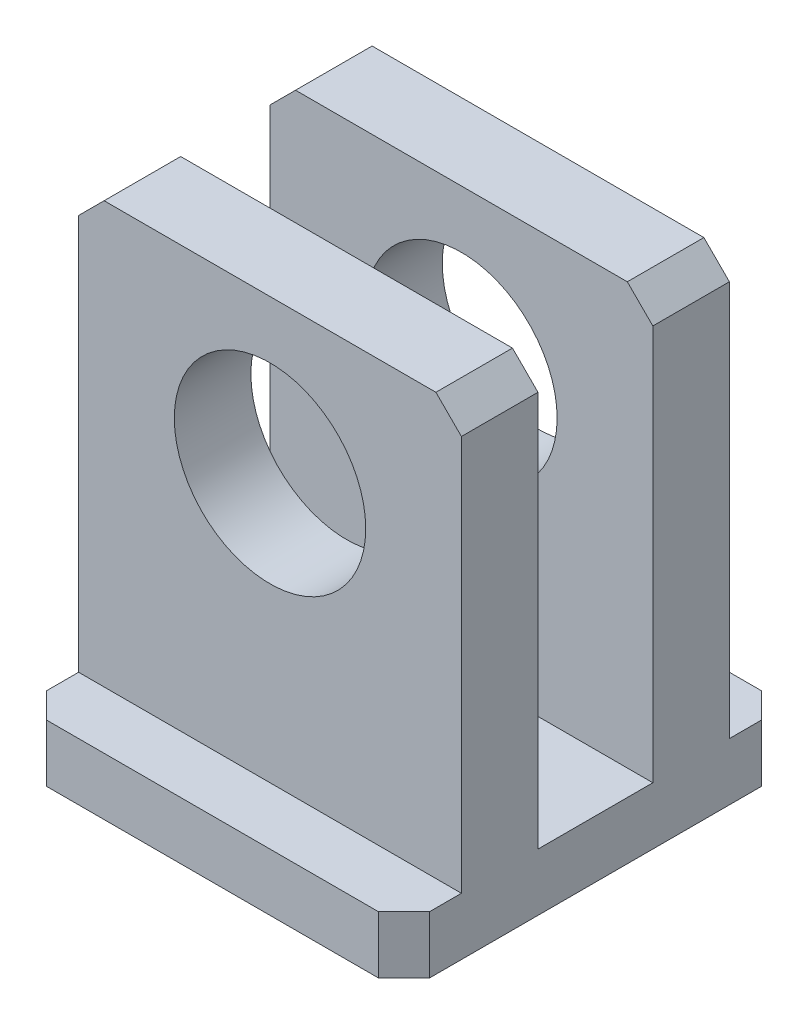
ISO-10303-21;
HEADER;
FILE_DESCRIPTION(('STEP AP214'),'2;1');
FILE_NAME('part.step','',(''),(''),'','','');
FILE_SCHEMA(('AUTOMOTIVE_DESIGN { 1 0 10303 214 1 1 1 1 }'));
ENDSEC;
DATA;
#1=APPLICATION_CONTEXT('core data for automotive mechanical design processes');
#2=APPLICATION_PROTOCOL_DEFINITION('international standard','automotive_design',2000,#1);
#3=PRODUCT_CONTEXT('',#1,'mechanical');
#4=PRODUCT('Part','Part','',(#3));
#5=PRODUCT_RELATED_PRODUCT_CATEGORY('part','',(#4));
#6=PRODUCT_DEFINITION_FORMATION('','',#4);
#7=PRODUCT_DEFINITION_CONTEXT('part definition',#1,'design');
#8=PRODUCT_DEFINITION('design','',#6,#7);
#9=PRODUCT_DEFINITION_SHAPE('','',#8);
#10=(LENGTH_UNIT() NAMED_UNIT(*) SI_UNIT(.MILLI.,.METRE.));
#11=(NAMED_UNIT(*) PLANE_ANGLE_UNIT() SI_UNIT($,.RADIAN.));
#12=(NAMED_UNIT(*) SI_UNIT($,.STERADIAN.) SOLID_ANGLE_UNIT());
#13=UNCERTAINTY_MEASURE_WITH_UNIT(LENGTH_MEASURE(1.E-05),#10,'distance_accuracy_value','');
#14=(GEOMETRIC_REPRESENTATION_CONTEXT(3) GLOBAL_UNCERTAINTY_ASSIGNED_CONTEXT((#13)) GLOBAL_UNIT_ASSIGNED_CONTEXT((#10,
#11,#12)) REPRESENTATION_CONTEXT('',''));
#15=CARTESIAN_POINT('',(0.,0.,0.));
#16=DIRECTION('',(0.,0.,1.));
#17=DIRECTION('',(1.,0.,0.));
#18=AXIS2_PLACEMENT_3D('',#15,#16,#17);
#19=CARTESIAN_POINT('',(0.,37.5,0.));
#20=DIRECTION('',(0.,1.,0.));
#21=DIRECTION('',(0.,0.,1.));
#22=AXIS2_PLACEMENT_3D('',#19,#20,#21);
#23=PLANE('',#22);
#24=DIRECTION('',(0.,0.,1.));
#25=VECTOR('',#24,1.);
#26=CARTESIAN_POINT('',(-13.,37.5,-15.));
#27=LINE('',#26,#25);
#28=CARTESIAN_POINT('',(-13.,37.5,4.5));
#29=VERTEX_POINT('',#28);
#30=CARTESIAN_POINT('',(-13.,37.5,10.5));
#31=VERTEX_POINT('',#30);
#32=EDGE_CURVE('E64',#29,#31,#27,.T.);
#33=ORIENTED_EDGE('',*,*,#32,.T.);
#34=DIRECTION('',(1.,0.,0.));
#35=VECTOR('',#34,1.);
#36=CARTESIAN_POINT('',(-15.,37.5,10.5));
#37=LINE('',#36,#35);
#38=CARTESIAN_POINT('',(13.,37.5,10.5));
#39=VERTEX_POINT('',#38);
#40=EDGE_CURVE('E195',#31,#39,#37,.T.);
#41=ORIENTED_EDGE('',*,*,#40,.T.);
#42=DIRECTION('',(0.,0.,1.));
#43=VECTOR('',#42,1.);
#44=CARTESIAN_POINT('',(13.,37.5,-15.));
#45=LINE('',#44,#43);
#46=CARTESIAN_POINT('',(13.,37.5,4.5));
#47=VERTEX_POINT('',#46);
#48=EDGE_CURVE('E334',#47,#39,#45,.T.);
#49=ORIENTED_EDGE('',*,*,#48,.F.);
#50=DIRECTION('',(1.,0.,0.));
#51=VECTOR('',#50,1.);
#52=CARTESIAN_POINT('',(-15.,37.5,4.5));
#53=LINE('',#52,#51);
#54=EDGE_CURVE('E293',#29,#47,#53,.T.);
#55=ORIENTED_EDGE('',*,*,#54,.F.);
#56=EDGE_LOOP('',(#33,#41,#49,#55));
#57=FACE_BOUND('',#56,.T.);
#58=ADVANCED_FACE('F41',(#57),#23,.T.);
#59=CARTESIAN_POINT('',(0.,4.5,0.));
#60=DIRECTION('',(0.,-1.,0.));
#61=DIRECTION('',(0.,0.,-1.));
#62=AXIS2_PLACEMENT_3D('',#59,#60,#61);
#63=PLANE('',#62);
#64=DIRECTION('',(1.,0.,0.));
#65=VECTOR('',#64,1.);
#66=CARTESIAN_POINT('',(-15.,4.5,10.5));
#67=LINE('',#66,#65);
#68=CARTESIAN_POINT('',(-15.,4.5,10.5));
#69=VERTEX_POINT('',#68);
#70=CARTESIAN_POINT('',(15.,4.5,10.5));
#71=VERTEX_POINT('',#70);
#72=EDGE_CURVE('E317',#69,#71,#67,.T.);
#73=ORIENTED_EDGE('',*,*,#72,.F.);
#74=DIRECTION('',(0.,0.,1.));
#75=VECTOR('',#74,1.);
#76=CARTESIAN_POINT('',(-15.,4.5,13.));
#77=LINE('',#76,#75);
#78=CARTESIAN_POINT('',(-15.,4.5,13.));
#79=VERTEX_POINT('',#78);
#80=EDGE_CURVE('E200',#69,#79,#77,.T.);
#81=ORIENTED_EDGE('',*,*,#80,.T.);
#82=DIRECTION('',(0.707106781186548,0.,0.707106781186548));
#83=VECTOR('',#82,1.);
#84=CARTESIAN_POINT('',(-15.,4.5,13.));
#85=LINE('',#84,#83);
#86=CARTESIAN_POINT('',(-13.,4.5,15.));
#87=VERTEX_POINT('',#86);
#88=EDGE_CURVE('E214',#79,#87,#85,.T.);
#89=ORIENTED_EDGE('',*,*,#88,.T.);
#90=DIRECTION('',(1.,0.,0.));
#91=VECTOR('',#90,1.);
#92=CARTESIAN_POINT('',(-13.,4.5,15.));
#93=LINE('',#92,#91);
#94=CARTESIAN_POINT('',(13.,4.5,15.));
#95=VERTEX_POINT('',#94);
#96=EDGE_CURVE('E216',#87,#95,#93,.T.);
#97=ORIENTED_EDGE('',*,*,#96,.T.);
#98=DIRECTION('',(0.707106781186548,0.,-0.707106781186548));
#99=VECTOR('',#98,1.);
#100=CARTESIAN_POINT('',(13.,4.5,15.));
#101=LINE('',#100,#99);
#102=CARTESIAN_POINT('',(15.,4.5,13.));
#103=VERTEX_POINT('',#102);
#104=EDGE_CURVE('E218',#95,#103,#101,.T.);
#105=ORIENTED_EDGE('',*,*,#104,.T.);
#106=DIRECTION('',(0.,0.,-1.));
#107=VECTOR('',#106,1.);
#108=CARTESIAN_POINT('',(15.,4.5,13.));
#109=LINE('',#108,#107);
#110=EDGE_CURVE('E221',#103,#71,#109,.T.);
#111=ORIENTED_EDGE('',*,*,#110,.T.);
#112=EDGE_LOOP('',(#73,#81,#89,#97,#105,#111));
#113=FACE_BOUND('',#112,.T.);
#114=ADVANCED_FACE('F322',(#113),#63,.F.);
#115=DIRECTION('',(-1.,0.,0.));
#116=VECTOR('',#115,1.);
#117=CARTESIAN_POINT('',(-15.,4.5,-10.5));
#118=LINE('',#117,#116);
#119=CARTESIAN_POINT('',(15.,4.5,-10.5));
#120=VERTEX_POINT('',#119);
#121=CARTESIAN_POINT('',(-15.,4.5,-10.5));
#122=VERTEX_POINT('',#121);
#123=EDGE_CURVE('E308',#120,#122,#118,.T.);
#124=ORIENTED_EDGE('',*,*,#123,.F.);
#125=CARTESIAN_POINT('',(15.,4.5,-13.));
#126=VERTEX_POINT('',#125);
#127=EDGE_CURVE('E220',#120,#126,#109,.T.);
#128=ORIENTED_EDGE('',*,*,#127,.T.);
#129=DIRECTION('',(-0.707106781186548,0.,-0.707106781186548));
#130=VECTOR('',#129,1.);
#131=CARTESIAN_POINT('',(13.,4.5,-15.));
#132=LINE('',#131,#130);
#133=CARTESIAN_POINT('',(13.,4.5,-15.));
#134=VERTEX_POINT('',#133);
#135=EDGE_CURVE('E224',#126,#134,#132,.T.);
#136=ORIENTED_EDGE('',*,*,#135,.T.);
#137=DIRECTION('',(-1.,0.,0.));
#138=VECTOR('',#137,1.);
#139=CARTESIAN_POINT('',(-13.,4.5,-15.));
#140=LINE('',#139,#138);
#141=CARTESIAN_POINT('',(-13.,4.5,-15.));
#142=VERTEX_POINT('',#141);
#143=EDGE_CURVE('E226',#134,#142,#140,.T.);
#144=ORIENTED_EDGE('',*,*,#143,.T.);
#145=DIRECTION('',(-0.707106781186548,0.,0.707106781186548));
#146=VECTOR('',#145,1.);
#147=CARTESIAN_POINT('',(-15.,4.5,-13.));
#148=LINE('',#147,#146);
#149=CARTESIAN_POINT('',(-15.,4.5,-13.));
#150=VERTEX_POINT('',#149);
#151=EDGE_CURVE('E228',#142,#150,#148,.T.);
#152=ORIENTED_EDGE('',*,*,#151,.T.);
#153=EDGE_CURVE('E211',#150,#122,#77,.T.);
#154=ORIENTED_EDGE('',*,*,#153,.T.);
#155=EDGE_LOOP('',(#124,#128,#136,#144,#152,#154));
#156=FACE_BOUND('',#155,.T.);
#157=ADVANCED_FACE('F395',(#156),#63,.F.);
#158=CARTESIAN_POINT('',(-15.,4.5,13.));
#159=DIRECTION('',(1.,0.,0.));
#160=DIRECTION('',(0.,0.,-1.));
#161=AXIS2_PLACEMENT_3D('',#158,#159,#160);
#162=PLANE('',#161);
#163=DIRECTION('',(0.,-1.,0.));
#164=VECTOR('',#163,1.);
#165=CARTESIAN_POINT('',(-15.,37.5,10.5));
#166=LINE('',#165,#164);
#167=CARTESIAN_POINT('',(-15.,35.5,10.5));
#168=VERTEX_POINT('',#167);
#169=EDGE_CURVE('E191',#168,#69,#166,.T.);
#170=ORIENTED_EDGE('',*,*,#169,.F.);
#171=DIRECTION('',(0.,0.,1.));
#172=VECTOR('',#171,1.);
#173=CARTESIAN_POINT('',(-15.,35.5,-15.));
#174=LINE('',#173,#172);
#175=CARTESIAN_POINT('',(-15.,35.5,4.5));
#176=VERTEX_POINT('',#175);
#177=EDGE_CURVE('E176',#176,#168,#174,.T.);
#178=ORIENTED_EDGE('',*,*,#177,.F.);
#179=DIRECTION('',(0.,1.,0.));
#180=VECTOR('',#179,1.);
#181=CARTESIAN_POINT('',(-15.,4.5,4.5));
#182=LINE('',#181,#180);
#183=CARTESIAN_POINT('',(-15.,4.5,4.5));
#184=VERTEX_POINT('',#183);
#185=EDGE_CURVE('E309',#184,#176,#182,.T.);
#186=ORIENTED_EDGE('',*,*,#185,.F.);
#187=DIRECTION('',(0.,0.,1.));
#188=VECTOR('',#187,1.);
#189=CARTESIAN_POINT('',(-15.,4.5,-4.5));
#190=LINE('',#189,#188);
#191=CARTESIAN_POINT('',(-15.,4.5,-4.5));
#192=VERTEX_POINT('',#191);
#193=EDGE_CURVE('E355',#192,#184,#190,.T.);
#194=ORIENTED_EDGE('',*,*,#193,.F.);
#195=DIRECTION('',(0.,1.,0.));
#196=VECTOR('',#195,1.);
#197=CARTESIAN_POINT('',(-15.,4.5,-4.5));
#198=LINE('',#197,#196);
#199=CARTESIAN_POINT('',(-15.,35.5,-4.5));
#200=VERTEX_POINT('',#199);
#201=EDGE_CURVE('E311',#192,#200,#198,.T.);
#202=ORIENTED_EDGE('',*,*,#201,.T.);
#203=CARTESIAN_POINT('',(-15.,35.5,-10.5));
#204=VERTEX_POINT('',#203);
#205=EDGE_CURVE('E185',#204,#200,#174,.T.);
#206=ORIENTED_EDGE('',*,*,#205,.F.);
#207=DIRECTION('',(0.,-1.,0.));
#208=VECTOR('',#207,1.);
#209=CARTESIAN_POINT('',(-15.,37.5,-10.5));
#210=LINE('',#209,#208);
#211=EDGE_CURVE('E201',#204,#122,#210,.T.);
#212=ORIENTED_EDGE('',*,*,#211,.T.);
#213=ORIENTED_EDGE('',*,*,#153,.F.);
#214=DIRECTION('',(0.,-1.,0.));
#215=VECTOR('',#214,1.);
#216=CARTESIAN_POINT('',(-15.,4.5,-13.));
#217=LINE('',#216,#215);
#218=CARTESIAN_POINT('',(-15.,0.,-13.));
#219=VERTEX_POINT('',#218);
#220=EDGE_CURVE('E230',#150,#219,#217,.T.);
#221=ORIENTED_EDGE('',*,*,#220,.T.);
#222=DIRECTION('',(0.,0.,1.));
#223=VECTOR('',#222,1.);
#224=CARTESIAN_POINT('',(-15.,0.,13.));
#225=LINE('',#224,#223);
#226=CARTESIAN_POINT('',(-15.,0.,13.));
#227=VERTEX_POINT('',#226);
#228=EDGE_CURVE('E210',#219,#227,#225,.T.);
#229=ORIENTED_EDGE('',*,*,#228,.T.);
#230=DIRECTION('',(0.,-1.,0.));
#231=VECTOR('',#230,1.);
#232=CARTESIAN_POINT('',(-15.,4.5,13.));
#233=LINE('',#232,#231);
#234=EDGE_CURVE('E267',#79,#227,#233,.T.);
#235=ORIENTED_EDGE('',*,*,#234,.F.);
#236=ORIENTED_EDGE('',*,*,#80,.F.);
#237=EDGE_LOOP('',(#170,#178,#186,#194,#202,#206,#212,#213,#221,#229,#235,#236));
#238=FACE_BOUND('',#237,.T.);
#239=ADVANCED_FACE('F43',(#238),#162,.F.);
#240=CARTESIAN_POINT('',(-15.,4.5,13.));
#241=DIRECTION('',(0.707106781186547,0.,-0.707106781186547));
#242=DIRECTION('',(-0.707106781186548,0.,-0.707106781186548));
#243=AXIS2_PLACEMENT_3D('',#240,#241,#242);
#244=PLANE('',#243);
#245=DIRECTION('',(0.707106781186548,0.,0.707106781186548));
#246=VECTOR('',#245,1.);
#247=CARTESIAN_POINT('',(-15.,0.,13.));
#248=LINE('',#247,#246);
#249=CARTESIAN_POINT('',(-13.,0.,15.));
#250=VERTEX_POINT('',#249);
#251=EDGE_CURVE('E233',#227,#250,#248,.T.);
#252=ORIENTED_EDGE('',*,*,#251,.T.);
#253=DIRECTION('',(0.,-1.,0.));
#254=VECTOR('',#253,1.);
#255=CARTESIAN_POINT('',(-13.,4.5,15.));
#256=LINE('',#255,#254);
#257=EDGE_CURVE('E264',#87,#250,#256,.T.);
#258=ORIENTED_EDGE('',*,*,#257,.F.);
#259=ORIENTED_EDGE('',*,*,#88,.F.);
#260=ORIENTED_EDGE('',*,*,#234,.T.);
#261=EDGE_LOOP('',(#252,#258,#259,#260));
#262=FACE_BOUND('',#261,.T.);
#263=ADVANCED_FACE('F438',(#262),#244,.F.);
#264=CARTESIAN_POINT('',(-13.,4.5,15.));
#265=DIRECTION('',(0.,0.,-1.));
#266=DIRECTION('',(-1.,0.,0.));
#267=AXIS2_PLACEMENT_3D('',#264,#265,#266);
#268=PLANE('',#267);
#269=DIRECTION('',(1.,0.,0.));
#270=VECTOR('',#269,1.);
#271=CARTESIAN_POINT('',(-13.,0.,15.));
#272=LINE('',#271,#270);
#273=CARTESIAN_POINT('',(13.,0.,15.));
#274=VERTEX_POINT('',#273);
#275=EDGE_CURVE('E235',#250,#274,#272,.T.);
#276=ORIENTED_EDGE('',*,*,#275,.T.);
#277=DIRECTION('',(0.,-1.,0.));
#278=VECTOR('',#277,1.);
#279=CARTESIAN_POINT('',(13.,4.5,15.));
#280=LINE('',#279,#278);
#281=EDGE_CURVE('E261',#95,#274,#280,.T.);
#282=ORIENTED_EDGE('',*,*,#281,.F.);
#283=ORIENTED_EDGE('',*,*,#96,.F.);
#284=ORIENTED_EDGE('',*,*,#257,.T.);
#285=EDGE_LOOP('',(#276,#282,#283,#284));
#286=FACE_BOUND('',#285,.T.);
#287=ADVANCED_FACE('F435',(#286),#268,.F.);
#288=CARTESIAN_POINT('',(13.,4.5,15.));
#289=DIRECTION('',(-0.707106781186547,0.,-0.707106781186547));
#290=DIRECTION('',(-0.707106781186548,0.,0.707106781186548));
#291=AXIS2_PLACEMENT_3D('',#288,#289,#290);
#292=PLANE('',#291);
#293=DIRECTION('',(0.707106781186548,0.,-0.707106781186548));
#294=VECTOR('',#293,1.);
#295=CARTESIAN_POINT('',(13.,0.,15.));
#296=LINE('',#295,#294);
#297=CARTESIAN_POINT('',(15.,0.,13.));
#298=VERTEX_POINT('',#297);
#299=EDGE_CURVE('E237',#274,#298,#296,.T.);
#300=ORIENTED_EDGE('',*,*,#299,.T.);
#301=DIRECTION('',(0.,-1.,0.));
#302=VECTOR('',#301,1.);
#303=CARTESIAN_POINT('',(15.,4.5,13.));
#304=LINE('',#303,#302);
#305=EDGE_CURVE('E258',#103,#298,#304,.T.);
#306=ORIENTED_EDGE('',*,*,#305,.F.);
#307=ORIENTED_EDGE('',*,*,#104,.F.);
#308=ORIENTED_EDGE('',*,*,#281,.T.);
#309=EDGE_LOOP('',(#300,#306,#307,#308));
#310=FACE_BOUND('',#309,.T.);
#311=ADVANCED_FACE('F432',(#310),#292,.F.);
#312=CARTESIAN_POINT('',(15.,4.5,13.));
#313=DIRECTION('',(-1.,0.,0.));
#314=DIRECTION('',(0.,0.,1.));
#315=AXIS2_PLACEMENT_3D('',#312,#313,#314);
#316=PLANE('',#315);
#317=DIRECTION('',(0.,-1.,0.));
#318=VECTOR('',#317,1.);
#319=CARTESIAN_POINT('',(15.,37.5,-10.5));
#320=LINE('',#319,#318);
#321=CARTESIAN_POINT('',(15.,35.5,-10.5));
#322=VERTEX_POINT('',#321);
#323=EDGE_CURVE('E204',#322,#120,#320,.T.);
#324=ORIENTED_EDGE('',*,*,#323,.F.);
#325=DIRECTION('',(0.,0.,1.));
#326=VECTOR('',#325,1.);
#327=CARTESIAN_POINT('',(15.,35.5,-15.));
#328=LINE('',#327,#326);
#329=CARTESIAN_POINT('',(15.,35.5,-4.5));
#330=VERTEX_POINT('',#329);
#331=EDGE_CURVE('E332',#322,#330,#328,.T.);
#332=ORIENTED_EDGE('',*,*,#331,.T.);
#333=DIRECTION('',(0.,1.,0.));
#334=VECTOR('',#333,1.);
#335=CARTESIAN_POINT('',(15.,4.5,-4.5));
#336=LINE('',#335,#334);
#337=CARTESIAN_POINT('',(15.,4.5,-4.5));
#338=VERTEX_POINT('',#337);
#339=EDGE_CURVE('E282',#338,#330,#336,.T.);
#340=ORIENTED_EDGE('',*,*,#339,.F.);
#341=DIRECTION('',(0.,0.,-1.));
#342=VECTOR('',#341,1.);
#343=CARTESIAN_POINT('',(15.,4.5,-4.5));
#344=LINE('',#343,#342);
#345=CARTESIAN_POINT('',(15.,4.5,4.5));
#346=VERTEX_POINT('',#345);
#347=EDGE_CURVE('E297',#346,#338,#344,.T.);
#348=ORIENTED_EDGE('',*,*,#347,.F.);
#349=DIRECTION('',(0.,1.,0.));
#350=VECTOR('',#349,1.);
#351=CARTESIAN_POINT('',(15.,4.5,4.5));
#352=LINE('',#351,#350);
#353=CARTESIAN_POINT('',(15.,35.5,4.5));
#354=VERTEX_POINT('',#353);
#355=EDGE_CURVE('E305',#346,#354,#352,.T.);
#356=ORIENTED_EDGE('',*,*,#355,.T.);
#357=CARTESIAN_POINT('',(15.,35.5,10.5));
#358=VERTEX_POINT('',#357);
#359=EDGE_CURVE('E56',#354,#358,#328,.T.);
#360=ORIENTED_EDGE('',*,*,#359,.T.);
#361=DIRECTION('',(0.,-1.,0.));
#362=VECTOR('',#361,1.);
#363=CARTESIAN_POINT('',(15.,37.5,10.5));
#364=LINE('',#363,#362);
#365=EDGE_CURVE('E202',#358,#71,#364,.T.);
#366=ORIENTED_EDGE('',*,*,#365,.T.);
#367=ORIENTED_EDGE('',*,*,#110,.F.);
#368=ORIENTED_EDGE('',*,*,#305,.T.);
#369=DIRECTION('',(0.,0.,-1.));
#370=VECTOR('',#369,1.);
#371=CARTESIAN_POINT('',(15.,0.,13.));
#372=LINE('',#371,#370);
#373=CARTESIAN_POINT('',(15.,0.,-13.));
#374=VERTEX_POINT('',#373);
#375=EDGE_CURVE('E239',#298,#374,#372,.T.);
#376=ORIENTED_EDGE('',*,*,#375,.T.);
#377=DIRECTION('',(0.,-1.,0.));
#378=VECTOR('',#377,1.);
#379=CARTESIAN_POINT('',(15.,4.5,-13.));
#380=LINE('',#379,#378);
#381=EDGE_CURVE('E255',#126,#374,#380,.T.);
#382=ORIENTED_EDGE('',*,*,#381,.F.);
#383=ORIENTED_EDGE('',*,*,#127,.F.);
#384=EDGE_LOOP('',(#324,#332,#340,#348,#356,#360,#366,#367,#368,#376,#382,#383));
#385=FACE_BOUND('',#384,.T.);
#386=ADVANCED_FACE('F329',(#385),#316,.F.);
#387=CARTESIAN_POINT('',(13.,4.5,-15.));
#388=DIRECTION('',(-0.707106781186547,0.,0.707106781186547));
#389=DIRECTION('',(0.707106781186548,0.,0.707106781186548));
#390=AXIS2_PLACEMENT_3D('',#387,#388,#389);
#391=PLANE('',#390);
#392=DIRECTION('',(-0.707106781186548,0.,-0.707106781186548));
#393=VECTOR('',#392,1.);
#394=CARTESIAN_POINT('',(13.,0.,-15.));
#395=LINE('',#394,#393);
#396=CARTESIAN_POINT('',(13.,0.,-15.));
#397=VERTEX_POINT('',#396);
#398=EDGE_CURVE('E241',#374,#397,#395,.T.);
#399=ORIENTED_EDGE('',*,*,#398,.T.);
#400=DIRECTION('',(0.,-1.,0.));
#401=VECTOR('',#400,1.);
#402=CARTESIAN_POINT('',(13.,4.5,-15.));
#403=LINE('',#402,#401);
#404=EDGE_CURVE('E252',#134,#397,#403,.T.);
#405=ORIENTED_EDGE('',*,*,#404,.F.);
#406=ORIENTED_EDGE('',*,*,#135,.F.);
#407=ORIENTED_EDGE('',*,*,#381,.T.);
#408=EDGE_LOOP('',(#399,#405,#406,#407));
#409=FACE_BOUND('',#408,.T.);
#410=ADVANCED_FACE('F425',(#409),#391,.F.);
#411=CARTESIAN_POINT('',(-13.,4.5,-15.));
#412=DIRECTION('',(0.,0.,1.));
#413=DIRECTION('',(1.,0.,0.));
#414=AXIS2_PLACEMENT_3D('',#411,#412,#413);
#415=PLANE('',#414);
#416=DIRECTION('',(-1.,0.,0.));
#417=VECTOR('',#416,1.);
#418=CARTESIAN_POINT('',(-13.,0.,-15.));
#419=LINE('',#418,#417);
#420=CARTESIAN_POINT('',(-13.,0.,-15.));
#421=VERTEX_POINT('',#420);
#422=EDGE_CURVE('E243',#397,#421,#419,.T.);
#423=ORIENTED_EDGE('',*,*,#422,.T.);
#424=DIRECTION('',(0.,-1.,0.));
#425=VECTOR('',#424,1.);
#426=CARTESIAN_POINT('',(-13.,4.5,-15.));
#427=LINE('',#426,#425);
#428=EDGE_CURVE('E249',#142,#421,#427,.T.);
#429=ORIENTED_EDGE('',*,*,#428,.F.);
#430=ORIENTED_EDGE('',*,*,#143,.F.);
#431=ORIENTED_EDGE('',*,*,#404,.T.);
#432=EDGE_LOOP('',(#423,#429,#430,#431));
#433=FACE_BOUND('',#432,.T.);
#434=ADVANCED_FACE('F421',(#433),#415,.F.);
#435=CARTESIAN_POINT('',(-15.,4.5,-13.));
#436=DIRECTION('',(0.707106781186547,0.,0.707106781186547));
#437=DIRECTION('',(0.707106781186548,0.,-0.707106781186548));
#438=AXIS2_PLACEMENT_3D('',#435,#436,#437);
#439=PLANE('',#438);
#440=DIRECTION('',(-0.707106781186548,0.,0.707106781186548));
#441=VECTOR('',#440,1.);
#442=CARTESIAN_POINT('',(-15.,0.,-13.));
#443=LINE('',#442,#441);
#444=EDGE_CURVE('E245',#421,#219,#443,.T.);
#445=ORIENTED_EDGE('',*,*,#444,.T.);
#446=ORIENTED_EDGE('',*,*,#220,.F.);
#447=ORIENTED_EDGE('',*,*,#151,.F.);
#448=ORIENTED_EDGE('',*,*,#428,.T.);
#449=EDGE_LOOP('',(#445,#446,#447,#448));
#450=FACE_BOUND('',#449,.T.);
#451=ADVANCED_FACE('F417',(#450),#439,.F.);
#452=CARTESIAN_POINT('',(0.,0.,0.));
#453=DIRECTION('',(0.,-1.,0.));
#454=DIRECTION('',(0.,0.,-1.));
#455=AXIS2_PLACEMENT_3D('',#452,#453,#454);
#456=PLANE('',#455);
#457=ORIENTED_EDGE('',*,*,#228,.F.);
#458=ORIENTED_EDGE('',*,*,#444,.F.);
#459=ORIENTED_EDGE('',*,*,#422,.F.);
#460=ORIENTED_EDGE('',*,*,#398,.F.);
#461=ORIENTED_EDGE('',*,*,#375,.F.);
#462=ORIENTED_EDGE('',*,*,#299,.F.);
#463=ORIENTED_EDGE('',*,*,#275,.F.);
#464=ORIENTED_EDGE('',*,*,#251,.F.);
#465=EDGE_LOOP('',(#457,#458,#459,#460,#461,#462,#463,#464));
#466=FACE_BOUND('',#465,.T.);
#467=ADVANCED_FACE('F410',(#466),#456,.T.);
#468=CARTESIAN_POINT('',(-15.,37.5,-10.5));
#469=DIRECTION('',(0.,0.,1.));
#470=DIRECTION('',(1.,0.,0.));
#471=AXIS2_PLACEMENT_3D('',#468,#469,#470);
#472=PLANE('',#471);
#473=CARTESIAN_POINT('',(0.,25.5,-10.5));
#474=DIRECTION('',(0.,0.,1.));
#475=DIRECTION('',(1.,0.,0.));
#476=AXIS2_PLACEMENT_3D('',#473,#474,#475);
#477=CIRCLE('',#476,7.5);
#478=CARTESIAN_POINT('',(7.5,25.5,-10.5));
#479=VERTEX_POINT('',#478);
#480=EDGE_CURVE('E294',#479,#479,#477,.T.);
#481=ORIENTED_EDGE('',*,*,#480,.T.);
#482=EDGE_LOOP('',(#481));
#483=FACE_BOUND('',#482,.T.);
#484=ORIENTED_EDGE('',*,*,#211,.F.);
#485=DIRECTION('',(0.707106781186547,0.707106781186548,0.));
#486=VECTOR('',#485,1.);
#487=CARTESIAN_POINT('',(-14.,36.5,-10.5));
#488=LINE('',#487,#486);
#489=CARTESIAN_POINT('',(-13.,37.5,-10.5));
#490=VERTEX_POINT('',#489);
#491=EDGE_CURVE('E344',#204,#490,#488,.T.);
#492=ORIENTED_EDGE('',*,*,#491,.T.);
#493=DIRECTION('',(-1.,0.,0.));
#494=VECTOR('',#493,1.);
#495=CARTESIAN_POINT('',(-15.,37.5,-10.5));
#496=LINE('',#495,#494);
#497=CARTESIAN_POINT('',(13.,37.5,-10.5));
#498=VERTEX_POINT('',#497);
#499=EDGE_CURVE('E315',#498,#490,#496,.T.);
#500=ORIENTED_EDGE('',*,*,#499,.F.);
#501=DIRECTION('',(0.707106781186547,-0.707106781186548,0.));
#502=VECTOR('',#501,1.);
#503=CARTESIAN_POINT('',(-0.999999999999985,51.5,-10.5));
#504=LINE('',#503,#502);
#505=EDGE_CURVE('E340',#498,#322,#504,.T.);
#506=ORIENTED_EDGE('',*,*,#505,.T.);
#507=ORIENTED_EDGE('',*,*,#323,.T.);
#508=ORIENTED_EDGE('',*,*,#123,.T.);
#509=EDGE_LOOP('',(#484,#492,#500,#506,#507,#508));
#510=FACE_BOUND('',#509,.T.);
#511=ADVANCED_FACE('F366',(#483,#510),#472,.F.);
#512=CARTESIAN_POINT('',(-15.,37.5,10.5));
#513=DIRECTION('',(0.,0.,-1.));
#514=DIRECTION('',(-1.,0.,0.));
#515=AXIS2_PLACEMENT_3D('',#512,#513,#514);
#516=PLANE('',#515);
#517=CARTESIAN_POINT('',(0.,25.5,10.5));
#518=DIRECTION('',(0.,0.,1.));
#519=DIRECTION('',(1.,0.,0.));
#520=AXIS2_PLACEMENT_3D('',#517,#518,#519);
#521=CIRCLE('',#520,7.5);
#522=CARTESIAN_POINT('',(7.5,25.5,10.5));
#523=VERTEX_POINT('',#522);
#524=EDGE_CURVE('E273',#523,#523,#521,.T.);
#525=ORIENTED_EDGE('',*,*,#524,.F.);
#526=EDGE_LOOP('',(#525));
#527=FACE_BOUND('',#526,.T.);
#528=ORIENTED_EDGE('',*,*,#40,.F.);
#529=DIRECTION('',(0.707106781186547,0.707106781186548,0.));
#530=VECTOR('',#529,1.);
#531=CARTESIAN_POINT('',(-15.,35.5,10.5));
#532=LINE('',#531,#530);
#533=EDGE_CURVE('E179',#168,#31,#532,.T.);
#534=ORIENTED_EDGE('',*,*,#533,.F.);
#535=ORIENTED_EDGE('',*,*,#169,.T.);
#536=ORIENTED_EDGE('',*,*,#72,.T.);
#537=ORIENTED_EDGE('',*,*,#365,.F.);
#538=DIRECTION('',(0.707106781186547,-0.707106781186548,0.));
#539=VECTOR('',#538,1.);
#540=CARTESIAN_POINT('',(13.,37.5,10.5));
#541=LINE('',#540,#539);
#542=EDGE_CURVE('E196',#39,#358,#541,.T.);
#543=ORIENTED_EDGE('',*,*,#542,.F.);
#544=EDGE_LOOP('',(#528,#534,#535,#536,#537,#543));
#545=FACE_BOUND('',#544,.T.);
#546=ADVANCED_FACE('F189',(#527,#545),#516,.F.);
#547=CARTESIAN_POINT('',(-13.,37.5,-4.5));
#548=VERTEX_POINT('',#547);
#549=EDGE_CURVE('E292',#490,#548,#27,.T.);
#550=ORIENTED_EDGE('',*,*,#549,.T.);
#551=DIRECTION('',(-1.,0.,0.));
#552=VECTOR('',#551,1.);
#553=CARTESIAN_POINT('',(-15.,37.5,-4.5));
#554=LINE('',#553,#552);
#555=CARTESIAN_POINT('',(13.,37.5,-4.5));
#556=VERTEX_POINT('',#555);
#557=EDGE_CURVE('E280',#556,#548,#554,.T.);
#558=ORIENTED_EDGE('',*,*,#557,.F.);
#559=EDGE_CURVE('E290',#498,#556,#45,.T.);
#560=ORIENTED_EDGE('',*,*,#559,.F.);
#561=ORIENTED_EDGE('',*,*,#499,.T.);
#562=EDGE_LOOP('',(#550,#558,#560,#561));
#563=FACE_BOUND('',#562,.T.);
#564=ADVANCED_FACE('F288',(#563),#23,.T.);
#565=CARTESIAN_POINT('',(-15.,4.5,4.5));
#566=DIRECTION('',(0.,0.,1.));
#567=DIRECTION('',(1.,0.,0.));
#568=AXIS2_PLACEMENT_3D('',#565,#566,#567);
#569=PLANE('',#568);
#570=CARTESIAN_POINT('',(0.,25.5,4.5));
#571=DIRECTION('',(0.,0.,1.));
#572=DIRECTION('',(1.,0.,0.));
#573=AXIS2_PLACEMENT_3D('',#570,#571,#572);
#574=CIRCLE('',#573,7.5);
#575=CARTESIAN_POINT('',(7.5,25.5,4.5));
#576=VERTEX_POINT('',#575);
#577=EDGE_CURVE('E272',#576,#576,#574,.T.);
#578=ORIENTED_EDGE('',*,*,#577,.T.);
#579=EDGE_LOOP('',(#578));
#580=FACE_BOUND('',#579,.T.);
#581=ORIENTED_EDGE('',*,*,#185,.T.);
#582=DIRECTION('',(0.707106781186547,0.707106781186548,0.));
#583=VECTOR('',#582,1.);
#584=CARTESIAN_POINT('',(-30.5,20.,4.5));
#585=LINE('',#584,#583);
#586=EDGE_CURVE('E180',#176,#29,#585,.T.);
#587=ORIENTED_EDGE('',*,*,#586,.T.);
#588=ORIENTED_EDGE('',*,*,#54,.T.);
#589=DIRECTION('',(0.707106781186547,-0.707106781186548,0.));
#590=VECTOR('',#589,1.);
#591=CARTESIAN_POINT('',(15.5,35.,4.5));
#592=LINE('',#591,#590);
#593=EDGE_CURVE('E338',#47,#354,#592,.T.);
#594=ORIENTED_EDGE('',*,*,#593,.T.);
#595=ORIENTED_EDGE('',*,*,#355,.F.);
#596=DIRECTION('',(1.,0.,0.));
#597=VECTOR('',#596,1.);
#598=CARTESIAN_POINT('',(-15.,4.5,4.5));
#599=LINE('',#598,#597);
#600=EDGE_CURVE('E302',#184,#346,#599,.T.);
#601=ORIENTED_EDGE('',*,*,#600,.F.);
#602=EDGE_LOOP('',(#581,#587,#588,#594,#595,#601));
#603=FACE_BOUND('',#602,.T.);
#604=ADVANCED_FACE('F376',(#580,#603),#569,.F.);
#605=CARTESIAN_POINT('',(-15.,4.5,-4.5));
#606=DIRECTION('',(0.,0.,-1.));
#607=DIRECTION('',(-1.,0.,0.));
#608=AXIS2_PLACEMENT_3D('',#605,#606,#607);
#609=PLANE('',#608);
#610=CARTESIAN_POINT('',(0.,25.5,-4.5));
#611=DIRECTION('',(0.,0.,-1.));
#612=DIRECTION('',(-1.,0.,0.));
#613=AXIS2_PLACEMENT_3D('',#610,#611,#612);
#614=CIRCLE('',#613,7.5);
#615=CARTESIAN_POINT('',(-7.5,25.5,-4.5));
#616=VERTEX_POINT('',#615);
#617=EDGE_CURVE('E270',#616,#616,#614,.T.);
#618=ORIENTED_EDGE('',*,*,#617,.T.);
#619=EDGE_LOOP('',(#618));
#620=FACE_BOUND('',#619,.T.);
#621=ORIENTED_EDGE('',*,*,#557,.T.);
#622=DIRECTION('',(-0.707106781186547,-0.707106781186548,0.));
#623=VECTOR('',#622,1.);
#624=CARTESIAN_POINT('',(-30.5,20.,-4.5));
#625=LINE('',#624,#623);
#626=EDGE_CURVE('E11',#548,#200,#625,.T.);
#627=ORIENTED_EDGE('',*,*,#626,.T.);
#628=ORIENTED_EDGE('',*,*,#201,.F.);
#629=DIRECTION('',(-1.,0.,0.));
#630=VECTOR('',#629,1.);
#631=CARTESIAN_POINT('',(-15.,4.5,-4.5));
#632=LINE('',#631,#630);
#633=EDGE_CURVE('E353',#338,#192,#632,.T.);
#634=ORIENTED_EDGE('',*,*,#633,.F.);
#635=ORIENTED_EDGE('',*,*,#339,.T.);
#636=DIRECTION('',(-0.707106781186547,0.707106781186548,0.));
#637=VECTOR('',#636,1.);
#638=CARTESIAN_POINT('',(15.5,35.,-4.5));
#639=LINE('',#638,#637);
#640=EDGE_CURVE('E49',#330,#556,#639,.T.);
#641=ORIENTED_EDGE('',*,*,#640,.T.);
#642=EDGE_LOOP('',(#621,#627,#628,#634,#635,#641));
#643=FACE_BOUND('',#642,.T.);
#644=ADVANCED_FACE('F279',(#620,#643),#609,.F.);
#645=CARTESIAN_POINT('',(0.,4.5,0.));
#646=DIRECTION('',(0.,1.,0.));
#647=DIRECTION('',(0.,0.,1.));
#648=AXIS2_PLACEMENT_3D('',#645,#646,#647);
#649=PLANE('',#648);
#650=ORIENTED_EDGE('',*,*,#347,.T.);
#651=ORIENTED_EDGE('',*,*,#633,.T.);
#652=ORIENTED_EDGE('',*,*,#193,.T.);
#653=ORIENTED_EDGE('',*,*,#600,.T.);
#654=EDGE_LOOP('',(#650,#651,#652,#653));
#655=FACE_BOUND('',#654,.T.);
#656=ADVANCED_FACE('F360',(#655),#649,.T.);
#657=CARTESIAN_POINT('',(0.,25.5,-15.));
#658=DIRECTION('',(0.,0.,1.));
#659=DIRECTION('',(1.,0.,0.));
#660=AXIS2_PLACEMENT_3D('',#657,#658,#659);
#661=CYLINDRICAL_SURFACE('',#660,7.5);
#662=ORIENTED_EDGE('',*,*,#617,.F.);
#663=EDGE_LOOP('',(#662));
#664=FACE_BOUND('',#663,.T.);
#665=ORIENTED_EDGE('',*,*,#480,.F.);
#666=EDGE_LOOP('',(#665));
#667=FACE_BOUND('',#666,.T.);
#668=ADVANCED_FACE('F473',(#664,#667),#661,.F.);
#669=ORIENTED_EDGE('',*,*,#524,.T.);
#670=EDGE_LOOP('',(#669));
#671=FACE_BOUND('',#670,.T.);
#672=ORIENTED_EDGE('',*,*,#577,.F.);
#673=EDGE_LOOP('',(#672));
#674=FACE_BOUND('',#673,.T.);
#675=ADVANCED_FACE('F387',(#671,#674),#661,.F.);
#676=CARTESIAN_POINT('',(13.,37.5,-15.));
#677=DIRECTION('',(-0.707106781186548,-0.707106781186547,0.));
#678=DIRECTION('',(0.707106781186547,-0.707106781186548,0.));
#679=AXIS2_PLACEMENT_3D('',#676,#677,#678);
#680=PLANE('',#679);
#681=ORIENTED_EDGE('',*,*,#559,.T.);
#682=ORIENTED_EDGE('',*,*,#640,.F.);
#683=ORIENTED_EDGE('',*,*,#331,.F.);
#684=ORIENTED_EDGE('',*,*,#505,.F.);
#685=EDGE_LOOP('',(#681,#682,#683,#684));
#686=FACE_BOUND('',#685,.T.);
#687=ADVANCED_FACE('F363',(#686),#680,.F.);
#688=CARTESIAN_POINT('',(-15.,35.5,-15.));
#689=DIRECTION('',(0.707106781186548,-0.707106781186547,0.));
#690=DIRECTION('',(0.707106781186547,0.707106781186548,0.));
#691=AXIS2_PLACEMENT_3D('',#688,#689,#690);
#692=PLANE('',#691);
#693=ORIENTED_EDGE('',*,*,#205,.T.);
#694=ORIENTED_EDGE('',*,*,#626,.F.);
#695=ORIENTED_EDGE('',*,*,#549,.F.);
#696=ORIENTED_EDGE('',*,*,#491,.F.);
#697=EDGE_LOOP('',(#693,#694,#695,#696));
#698=FACE_BOUND('',#697,.T.);
#699=ADVANCED_FACE('F370',(#698),#692,.F.);
#700=ORIENTED_EDGE('',*,*,#48,.T.);
#701=ORIENTED_EDGE('',*,*,#542,.T.);
#702=ORIENTED_EDGE('',*,*,#359,.F.);
#703=ORIENTED_EDGE('',*,*,#593,.F.);
#704=EDGE_LOOP('',(#700,#701,#702,#703));
#705=FACE_BOUND('',#704,.T.);
#706=ADVANCED_FACE('F377',(#705),#680,.F.);
#707=ORIENTED_EDGE('',*,*,#177,.T.);
#708=ORIENTED_EDGE('',*,*,#533,.T.);
#709=ORIENTED_EDGE('',*,*,#32,.F.);
#710=ORIENTED_EDGE('',*,*,#586,.F.);
#711=EDGE_LOOP('',(#707,#708,#709,#710));
#712=FACE_BOUND('',#711,.T.);
#713=ADVANCED_FACE('F178',(#712),#692,.F.);
#714=CLOSED_SHELL('',(#58,#114,#157,#239,#263,#287,#311,#386,#410,#434,#451,#467,#511,#546,#564,
#604,#644,#656,#668,#675,#687,#699,#706,#713));
#715=MANIFOLD_SOLID_BREP('B2',#714);
#716=ADVANCED_BREP_SHAPE_REPRESENTATION('',(#18,#715),#14);
#717=SHAPE_DEFINITION_REPRESENTATION(#9,#716);
ENDSEC;
END-ISO-10303-21;
